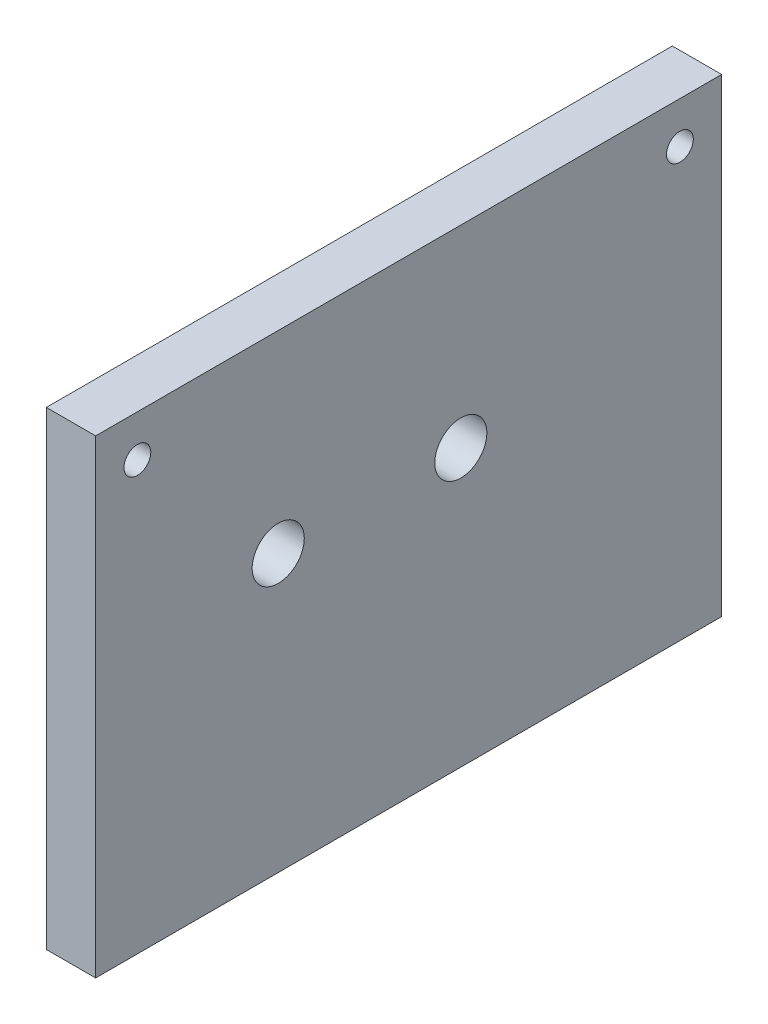
ISO-10303-21;
HEADER;
FILE_DESCRIPTION(('STEP AP214'),'2;1');
FILE_NAME('part.step','',(''),(''),'','','');
FILE_SCHEMA(('AUTOMOTIVE_DESIGN { 1 0 10303 214 1 1 1 1 }'));
ENDSEC;
DATA;
#1=APPLICATION_CONTEXT('core data for automotive mechanical design processes');
#2=APPLICATION_PROTOCOL_DEFINITION('international standard','automotive_design',2000,#1);
#3=PRODUCT_CONTEXT('',#1,'mechanical');
#4=PRODUCT('Part','Part','',(#3));
#5=PRODUCT_RELATED_PRODUCT_CATEGORY('part','',(#4));
#6=PRODUCT_DEFINITION_FORMATION('','',#4);
#7=PRODUCT_DEFINITION_CONTEXT('part definition',#1,'design');
#8=PRODUCT_DEFINITION('design','',#6,#7);
#9=PRODUCT_DEFINITION_SHAPE('','',#8);
#10=(LENGTH_UNIT() NAMED_UNIT(*) SI_UNIT(.MILLI.,.METRE.));
#11=(NAMED_UNIT(*) PLANE_ANGLE_UNIT() SI_UNIT($,.RADIAN.));
#12=(NAMED_UNIT(*) SI_UNIT($,.STERADIAN.) SOLID_ANGLE_UNIT());
#13=UNCERTAINTY_MEASURE_WITH_UNIT(LENGTH_MEASURE(1.E-05),#10,'distance_accuracy_value','');
#14=(GEOMETRIC_REPRESENTATION_CONTEXT(3) GLOBAL_UNCERTAINTY_ASSIGNED_CONTEXT((#13)) GLOBAL_UNIT_ASSIGNED_CONTEXT((#10,
#11,#12)) REPRESENTATION_CONTEXT('',''));
#15=CARTESIAN_POINT('',(0.,0.,0.));
#16=DIRECTION('',(0.,0.,1.));
#17=DIRECTION('',(1.,0.,0.));
#18=AXIS2_PLACEMENT_3D('',#15,#16,#17);
#19=CARTESIAN_POINT('',(12.,0.,0.));
#20=DIRECTION('',(1.,0.,0.));
#21=DIRECTION('',(0.,0.,-1.));
#22=AXIS2_PLACEMENT_3D('',#19,#20,#21);
#23=PLANE('',#22);
#24=CARTESIAN_POINT('',(12.,46.99,-66.04));
#25=DIRECTION('',(1.,0.,0.));
#26=DIRECTION('',(0.,0.,-1.));
#27=AXIS2_PLACEMENT_3D('',#24,#25,#26);
#28=CIRCLE('',#27,3.2639);
#29=CARTESIAN_POINT('',(12.,46.99,-69.3039));
#30=VERTEX_POINT('',#29);
#31=EDGE_CURVE('E247',#30,#30,#28,.T.);
#32=ORIENTED_EDGE('',*,*,#31,.F.);
#33=EDGE_LOOP('',(#32));
#34=FACE_BOUND('',#33,.T.);
#35=CARTESIAN_POINT('',(12.,46.99,66.04));
#36=DIRECTION('',(1.,0.,0.));
#37=DIRECTION('',(0.,0.,-1.));
#38=AXIS2_PLACEMENT_3D('',#35,#36,#37);
#39=CIRCLE('',#38,3.2639);
#40=CARTESIAN_POINT('',(12.,46.99,62.7761));
#41=VERTEX_POINT('',#40);
#42=EDGE_CURVE('E122',#41,#41,#39,.T.);
#43=ORIENTED_EDGE('',*,*,#42,.F.);
#44=EDGE_LOOP('',(#43));
#45=FACE_BOUND('',#44,.T.);
#46=CARTESIAN_POINT('',(12.,10.16,31.75));
#47=DIRECTION('',(1.,0.,0.));
#48=DIRECTION('',(0.,0.,-1.));
#49=AXIS2_PLACEMENT_3D('',#46,#47,#48);
#50=CIRCLE('',#49,6.34365);
#51=CARTESIAN_POINT('',(12.,10.16,25.40635));
#52=VERTEX_POINT('',#51);
#53=EDGE_CURVE('E146',#52,#52,#50,.T.);
#54=ORIENTED_EDGE('',*,*,#53,.F.);
#55=EDGE_LOOP('',(#54));
#56=FACE_BOUND('',#55,.T.);
#57=DIRECTION('',(0.,1.,0.));
#58=VECTOR('',#57,1.);
#59=CARTESIAN_POINT('',(12.,57.15,-76.2));
#60=LINE('',#59,#58);
#61=CARTESIAN_POINT('',(12.,-57.15,-76.2));
#62=VERTEX_POINT('',#61);
#63=CARTESIAN_POINT('',(12.,57.15,-76.2));
#64=VERTEX_POINT('',#63);
#65=EDGE_CURVE('E154',#62,#64,#60,.T.);
#66=ORIENTED_EDGE('',*,*,#65,.T.);
#67=DIRECTION('',(0.,0.,1.));
#68=VECTOR('',#67,1.);
#69=CARTESIAN_POINT('',(12.,57.15,76.2));
#70=LINE('',#69,#68);
#71=CARTESIAN_POINT('',(12.,57.15,76.2));
#72=VERTEX_POINT('',#71);
#73=EDGE_CURVE('E92',#64,#72,#70,.T.);
#74=ORIENTED_EDGE('',*,*,#73,.T.);
#75=DIRECTION('',(0.,-1.,0.));
#76=VECTOR('',#75,1.);
#77=CARTESIAN_POINT('',(12.,57.15,76.2));
#78=LINE('',#77,#76);
#79=CARTESIAN_POINT('',(12.,-57.15,76.2));
#80=VERTEX_POINT('',#79);
#81=EDGE_CURVE('E159',#72,#80,#78,.T.);
#82=ORIENTED_EDGE('',*,*,#81,.T.);
#83=DIRECTION('',(0.,0.,-1.));
#84=VECTOR('',#83,1.);
#85=CARTESIAN_POINT('',(12.,-57.15,76.2));
#86=LINE('',#85,#84);
#87=EDGE_CURVE('E61',#80,#62,#86,.T.);
#88=ORIENTED_EDGE('',*,*,#87,.T.);
#89=EDGE_LOOP('',(#66,#74,#82,#88));
#90=FACE_BOUND('',#89,.T.);
#91=CARTESIAN_POINT('',(12.,10.16,-12.7));
#92=DIRECTION('',(1.,0.,0.));
#93=DIRECTION('',(0.,0.,-1.));
#94=AXIS2_PLACEMENT_3D('',#91,#92,#93);
#95=CIRCLE('',#94,6.34365);
#96=CARTESIAN_POINT('',(12.,10.16,-19.04365));
#97=VERTEX_POINT('',#96);
#98=EDGE_CURVE('E138',#97,#97,#95,.T.);
#99=ORIENTED_EDGE('',*,*,#98,.F.);
#100=EDGE_LOOP('',(#99));
#101=FACE_BOUND('',#100,.T.);
#102=ADVANCED_FACE('F43',(#34,#45,#56,#90,#101),#23,.T.);
#103=CARTESIAN_POINT('',(0.,0.,0.));
#104=DIRECTION('',(1.,0.,0.));
#105=DIRECTION('',(0.,0.,-1.));
#106=AXIS2_PLACEMENT_3D('',#103,#104,#105);
#107=PLANE('',#106);
#108=CARTESIAN_POINT('',(0.,46.99,-66.04));
#109=DIRECTION('',(-1.,0.,0.));
#110=DIRECTION('',(0.,0.,1.));
#111=AXIS2_PLACEMENT_3D('',#108,#109,#110);
#112=CIRCLE('',#111,3.2639);
#113=CARTESIAN_POINT('',(0.,46.99,-62.7761));
#114=VERTEX_POINT('',#113);
#115=EDGE_CURVE('E250',#114,#114,#112,.T.);
#116=ORIENTED_EDGE('',*,*,#115,.F.);
#117=EDGE_LOOP('',(#116));
#118=FACE_BOUND('',#117,.T.);
#119=CARTESIAN_POINT('',(0.,46.99,66.04));
#120=DIRECTION('',(-1.,0.,0.));
#121=DIRECTION('',(0.,0.,1.));
#122=AXIS2_PLACEMENT_3D('',#119,#120,#121);
#123=CIRCLE('',#122,3.2639);
#124=CARTESIAN_POINT('',(0.,46.99,69.3039));
#125=VERTEX_POINT('',#124);
#126=EDGE_CURVE('E254',#125,#125,#123,.T.);
#127=ORIENTED_EDGE('',*,*,#126,.F.);
#128=EDGE_LOOP('',(#127));
#129=FACE_BOUND('',#128,.T.);
#130=DIRECTION('',(0.,1.,0.));
#131=VECTOR('',#130,1.);
#132=CARTESIAN_POINT('',(0.,57.15,-76.2));
#133=LINE('',#132,#131);
#134=CARTESIAN_POINT('',(0.,-57.15,-76.2));
#135=VERTEX_POINT('',#134);
#136=CARTESIAN_POINT('',(0.,57.15,-76.2));
#137=VERTEX_POINT('',#136);
#138=EDGE_CURVE('E150',#135,#137,#133,.T.);
#139=ORIENTED_EDGE('',*,*,#138,.F.);
#140=DIRECTION('',(0.,0.,-1.));
#141=VECTOR('',#140,1.);
#142=CARTESIAN_POINT('',(0.,-57.15,76.2));
#143=LINE('',#142,#141);
#144=CARTESIAN_POINT('',(0.,-57.15,76.2));
#145=VERTEX_POINT('',#144);
#146=EDGE_CURVE('E85',#145,#135,#143,.T.);
#147=ORIENTED_EDGE('',*,*,#146,.F.);
#148=DIRECTION('',(0.,-1.,0.));
#149=VECTOR('',#148,1.);
#150=CARTESIAN_POINT('',(0.,57.15,76.2));
#151=LINE('',#150,#149);
#152=CARTESIAN_POINT('',(0.,57.15,76.2));
#153=VERTEX_POINT('',#152);
#154=EDGE_CURVE('E79',#153,#145,#151,.T.);
#155=ORIENTED_EDGE('',*,*,#154,.F.);
#156=DIRECTION('',(0.,0.,1.));
#157=VECTOR('',#156,1.);
#158=CARTESIAN_POINT('',(0.,57.15,76.2));
#159=LINE('',#158,#157);
#160=EDGE_CURVE('E168',#137,#153,#159,.T.);
#161=ORIENTED_EDGE('',*,*,#160,.F.);
#162=EDGE_LOOP('',(#139,#147,#155,#161));
#163=FACE_BOUND('',#162,.T.);
#164=CARTESIAN_POINT('',(0.,10.16,31.75));
#165=DIRECTION('',(1.,0.,0.));
#166=DIRECTION('',(0.,0.,-1.));
#167=AXIS2_PLACEMENT_3D('',#164,#165,#166);
#168=CIRCLE('',#167,6.34365);
#169=CARTESIAN_POINT('',(0.,10.16,25.40635));
#170=VERTEX_POINT('',#169);
#171=EDGE_CURVE('E142',#170,#170,#168,.T.);
#172=ORIENTED_EDGE('',*,*,#171,.T.);
#173=EDGE_LOOP('',(#172));
#174=FACE_BOUND('',#173,.T.);
#175=CARTESIAN_POINT('',(0.,10.16,-12.7));
#176=DIRECTION('',(1.,0.,0.));
#177=DIRECTION('',(0.,0.,-1.));
#178=AXIS2_PLACEMENT_3D('',#175,#176,#177);
#179=CIRCLE('',#178,6.34365);
#180=CARTESIAN_POINT('',(0.,10.16,-19.04365));
#181=VERTEX_POINT('',#180);
#182=EDGE_CURVE('E137',#181,#181,#179,.T.);
#183=ORIENTED_EDGE('',*,*,#182,.T.);
#184=EDGE_LOOP('',(#183));
#185=FACE_BOUND('',#184,.T.);
#186=ADVANCED_FACE('F184',(#118,#129,#163,#174,#185),#107,.F.);
#187=CARTESIAN_POINT('',(12.,57.15,-76.2));
#188=DIRECTION('',(0.,0.,1.));
#189=DIRECTION('',(0.,-1.,0.));
#190=AXIS2_PLACEMENT_3D('',#187,#188,#189);
#191=PLANE('',#190);
#192=ORIENTED_EDGE('',*,*,#138,.T.);
#193=DIRECTION('',(-1.,0.,0.));
#194=VECTOR('',#193,1.);
#195=CARTESIAN_POINT('',(12.,57.15,-76.2));
#196=LINE('',#195,#194);
#197=EDGE_CURVE('E11',#64,#137,#196,.T.);
#198=ORIENTED_EDGE('',*,*,#197,.F.);
#199=ORIENTED_EDGE('',*,*,#65,.F.);
#200=DIRECTION('',(-1.,0.,0.));
#201=VECTOR('',#200,1.);
#202=CARTESIAN_POINT('',(12.,-57.15,-76.2));
#203=LINE('',#202,#201);
#204=EDGE_CURVE('E164',#62,#135,#203,.T.);
#205=ORIENTED_EDGE('',*,*,#204,.T.);
#206=EDGE_LOOP('',(#192,#198,#199,#205));
#207=FACE_BOUND('',#206,.T.);
#208=ADVANCED_FACE('F45',(#207),#191,.F.);
#209=CARTESIAN_POINT('',(12.,57.15,76.2));
#210=DIRECTION('',(0.,-1.,0.));
#211=DIRECTION('',(0.,0.,-1.));
#212=AXIS2_PLACEMENT_3D('',#209,#210,#211);
#213=PLANE('',#212);
#214=ORIENTED_EDGE('',*,*,#160,.T.);
#215=DIRECTION('',(-1.,0.,0.));
#216=VECTOR('',#215,1.);
#217=CARTESIAN_POINT('',(12.,57.15,76.2));
#218=LINE('',#217,#216);
#219=EDGE_CURVE('E53',#72,#153,#218,.T.);
#220=ORIENTED_EDGE('',*,*,#219,.F.);
#221=ORIENTED_EDGE('',*,*,#73,.F.);
#222=ORIENTED_EDGE('',*,*,#197,.T.);
#223=EDGE_LOOP('',(#214,#220,#221,#222));
#224=FACE_BOUND('',#223,.T.);
#225=ADVANCED_FACE('F201',(#224),#213,.F.);
#226=CARTESIAN_POINT('',(12.,57.15,76.2));
#227=DIRECTION('',(0.,0.,-1.));
#228=DIRECTION('',(0.,1.,0.));
#229=AXIS2_PLACEMENT_3D('',#226,#227,#228);
#230=PLANE('',#229);
#231=ORIENTED_EDGE('',*,*,#154,.T.);
#232=DIRECTION('',(-1.,0.,0.));
#233=VECTOR('',#232,1.);
#234=CARTESIAN_POINT('',(12.,-57.15,76.2));
#235=LINE('',#234,#233);
#236=EDGE_CURVE('E177',#80,#145,#235,.T.);
#237=ORIENTED_EDGE('',*,*,#236,.F.);
#238=ORIENTED_EDGE('',*,*,#81,.F.);
#239=ORIENTED_EDGE('',*,*,#219,.T.);
#240=EDGE_LOOP('',(#231,#237,#238,#239));
#241=FACE_BOUND('',#240,.T.);
#242=ADVANCED_FACE('F181',(#241),#230,.F.);
#243=CARTESIAN_POINT('',(12.,-57.15,76.2));
#244=DIRECTION('',(0.,1.,0.));
#245=DIRECTION('',(0.,0.,1.));
#246=AXIS2_PLACEMENT_3D('',#243,#244,#245);
#247=PLANE('',#246);
#248=CARTESIAN_POINT('',(6.,-57.15,66.675));
#249=DIRECTION('',(0.,-1.,0.));
#250=DIRECTION('',(0.,0.,-1.));
#251=AXIS2_PLACEMENT_3D('',#248,#249,#250);
#252=CIRCLE('',#251,2.01929999999999);
#253=CARTESIAN_POINT('',(6.,-57.15,64.6557));
#254=VERTEX_POINT('',#253);
#255=EDGE_CURVE('E114',#254,#254,#252,.T.);
#256=ORIENTED_EDGE('',*,*,#255,.F.);
#257=EDGE_LOOP('',(#256));
#258=FACE_BOUND('',#257,.T.);
#259=CARTESIAN_POINT('',(6.,-57.15,0.));
#260=DIRECTION('',(0.,-1.,0.));
#261=DIRECTION('',(0.,0.,-1.));
#262=AXIS2_PLACEMENT_3D('',#259,#260,#261);
#263=CIRCLE('',#262,2.01929999999999);
#264=CARTESIAN_POINT('',(6.,-57.15,-2.01929999999999));
#265=VERTEX_POINT('',#264);
#266=EDGE_CURVE('E113',#265,#265,#263,.T.);
#267=ORIENTED_EDGE('',*,*,#266,.F.);
#268=EDGE_LOOP('',(#267));
#269=FACE_BOUND('',#268,.T.);
#270=CARTESIAN_POINT('',(6.,-57.15,-66.675));
#271=DIRECTION('',(0.,-1.,0.));
#272=DIRECTION('',(0.,0.,-1.));
#273=AXIS2_PLACEMENT_3D('',#270,#271,#272);
#274=CIRCLE('',#273,2.01929999999999);
#275=CARTESIAN_POINT('',(6.,-57.15,-68.6943));
#276=VERTEX_POINT('',#275);
#277=EDGE_CURVE('E129',#276,#276,#274,.T.);
#278=ORIENTED_EDGE('',*,*,#277,.F.);
#279=EDGE_LOOP('',(#278));
#280=FACE_BOUND('',#279,.T.);
#281=ORIENTED_EDGE('',*,*,#146,.T.);
#282=ORIENTED_EDGE('',*,*,#204,.F.);
#283=ORIENTED_EDGE('',*,*,#87,.F.);
#284=ORIENTED_EDGE('',*,*,#236,.T.);
#285=EDGE_LOOP('',(#281,#282,#283,#284));
#286=FACE_BOUND('',#285,.T.);
#287=ADVANCED_FACE('F189',(#258,#269,#280,#286),#247,.F.);
#288=CARTESIAN_POINT('',(12.,10.16,31.75));
#289=DIRECTION('',(-1.,0.,0.));
#290=DIRECTION('',(0.,0.,1.));
#291=AXIS2_PLACEMENT_3D('',#288,#289,#290);
#292=CYLINDRICAL_SURFACE('',#291,6.34365);
#293=ORIENTED_EDGE('',*,*,#53,.T.);
#294=EDGE_LOOP('',(#293));
#295=FACE_BOUND('',#294,.T.);
#296=ORIENTED_EDGE('',*,*,#171,.F.);
#297=EDGE_LOOP('',(#296));
#298=FACE_BOUND('',#297,.T.);
#299=ADVANCED_FACE('F191',(#295,#298),#292,.F.);
#300=CARTESIAN_POINT('',(12.,10.16,-12.7));
#301=DIRECTION('',(-1.,0.,0.));
#302=DIRECTION('',(0.,0.,1.));
#303=AXIS2_PLACEMENT_3D('',#300,#301,#302);
#304=CYLINDRICAL_SURFACE('',#303,6.34365);
#305=ORIENTED_EDGE('',*,*,#98,.T.);
#306=EDGE_LOOP('',(#305));
#307=FACE_BOUND('',#306,.T.);
#308=ORIENTED_EDGE('',*,*,#182,.F.);
#309=EDGE_LOOP('',(#308));
#310=FACE_BOUND('',#309,.T.);
#311=ADVANCED_FACE('F198',(#307,#310),#304,.F.);
#312=CARTESIAN_POINT('',(6.,-44.45,-66.675));
#313=DIRECTION('',(0.,-1.,0.));
#314=DIRECTION('',(0.,0.,-1.));
#315=AXIS2_PLACEMENT_3D('',#312,#313,#314);
#316=CONICAL_SURFACE('',#315,2.0193,1.02974425867665);
#317=CARTESIAN_POINT('',(6.,-43.2366821519976,-66.675));
#318=VERTEX_POINT('',#317);
#319=VERTEX_LOOP('',#318);
#320=FACE_BOUND('',#319,.T.);
#321=CARTESIAN_POINT('',(6.,-44.45,-66.675));
#322=DIRECTION('',(0.,-1.,0.));
#323=DIRECTION('',(0.,0.,-1.));
#324=AXIS2_PLACEMENT_3D('',#321,#322,#323);
#325=CIRCLE('',#324,2.0193);
#326=CARTESIAN_POINT('',(6.,-44.45,-68.6943));
#327=VERTEX_POINT('',#326);
#328=EDGE_CURVE('E133',#327,#327,#325,.T.);
#329=ORIENTED_EDGE('',*,*,#328,.T.);
#330=EDGE_LOOP('',(#329));
#331=FACE_BOUND('',#330,.T.);
#332=ADVANCED_FACE('F218',(#320,#331),#316,.F.);
#333=CARTESIAN_POINT('',(6.,-57.15,-66.675));
#334=DIRECTION('',(0.,-1.,0.));
#335=DIRECTION('',(0.,0.,-1.));
#336=AXIS2_PLACEMENT_3D('',#333,#334,#335);
#337=CYLINDRICAL_SURFACE('',#336,2.01929999999999);
#338=ORIENTED_EDGE('',*,*,#328,.F.);
#339=EDGE_LOOP('',(#338));
#340=FACE_BOUND('',#339,.T.);
#341=ORIENTED_EDGE('',*,*,#277,.T.);
#342=EDGE_LOOP('',(#341));
#343=FACE_BOUND('',#342,.T.);
#344=ADVANCED_FACE('F222',(#340,#343),#337,.F.);
#345=CARTESIAN_POINT('',(6.,-44.45,0.));
#346=DIRECTION('',(0.,-1.,0.));
#347=DIRECTION('',(0.,0.,-1.));
#348=AXIS2_PLACEMENT_3D('',#345,#346,#347);
#349=CONICAL_SURFACE('',#348,2.0193,1.02974425867665);
#350=CARTESIAN_POINT('',(5.99999999999999,-43.2366821519976,0.));
#351=VERTEX_POINT('',#350);
#352=VERTEX_LOOP('',#351);
#353=FACE_BOUND('',#352,.T.);
#354=CARTESIAN_POINT('',(6.,-44.45,0.));
#355=DIRECTION('',(0.,-1.,0.));
#356=DIRECTION('',(0.,0.,-1.));
#357=AXIS2_PLACEMENT_3D('',#354,#355,#356);
#358=CIRCLE('',#357,2.0193);
#359=CARTESIAN_POINT('',(6.,-44.45,-2.0193));
#360=VERTEX_POINT('',#359);
#361=EDGE_CURVE('E119',#360,#360,#358,.T.);
#362=ORIENTED_EDGE('',*,*,#361,.T.);
#363=EDGE_LOOP('',(#362));
#364=FACE_BOUND('',#363,.T.);
#365=ADVANCED_FACE('F226',(#353,#364),#349,.F.);
#366=CARTESIAN_POINT('',(6.,-57.15,0.));
#367=DIRECTION('',(0.,-1.,0.));
#368=DIRECTION('',(0.,0.,-1.));
#369=AXIS2_PLACEMENT_3D('',#366,#367,#368);
#370=CYLINDRICAL_SURFACE('',#369,2.01929999999999);
#371=ORIENTED_EDGE('',*,*,#361,.F.);
#372=EDGE_LOOP('',(#371));
#373=FACE_BOUND('',#372,.T.);
#374=ORIENTED_EDGE('',*,*,#266,.T.);
#375=EDGE_LOOP('',(#374));
#376=FACE_BOUND('',#375,.T.);
#377=ADVANCED_FACE('F106',(#373,#376),#370,.F.);
#378=CARTESIAN_POINT('',(6.,-44.45,66.675));
#379=DIRECTION('',(0.,-1.,0.));
#380=DIRECTION('',(0.,0.,-1.));
#381=AXIS2_PLACEMENT_3D('',#378,#379,#380);
#382=CONICAL_SURFACE('',#381,2.0193,1.02974425867665);
#383=CARTESIAN_POINT('',(5.99999999999999,-43.2366821519976,66.675));
#384=VERTEX_POINT('',#383);
#385=VERTEX_LOOP('',#384);
#386=FACE_BOUND('',#385,.T.);
#387=CARTESIAN_POINT('',(6.,-44.45,66.675));
#388=DIRECTION('',(0.,-1.,0.));
#389=DIRECTION('',(0.,0.,-1.));
#390=AXIS2_PLACEMENT_3D('',#387,#388,#389);
#391=CIRCLE('',#390,2.0193);
#392=CARTESIAN_POINT('',(6.,-44.45,64.6557));
#393=VERTEX_POINT('',#392);
#394=EDGE_CURVE('E110',#393,#393,#391,.T.);
#395=ORIENTED_EDGE('',*,*,#394,.T.);
#396=EDGE_LOOP('',(#395));
#397=FACE_BOUND('',#396,.T.);
#398=ADVANCED_FACE('F102',(#386,#397),#382,.F.);
#399=CARTESIAN_POINT('',(6.,-57.15,66.675));
#400=DIRECTION('',(0.,-1.,0.));
#401=DIRECTION('',(0.,0.,-1.));
#402=AXIS2_PLACEMENT_3D('',#399,#400,#401);
#403=CYLINDRICAL_SURFACE('',#402,2.01929999999999);
#404=ORIENTED_EDGE('',*,*,#394,.F.);
#405=EDGE_LOOP('',(#404));
#406=FACE_BOUND('',#405,.T.);
#407=ORIENTED_EDGE('',*,*,#255,.T.);
#408=EDGE_LOOP('',(#407));
#409=FACE_BOUND('',#408,.T.);
#410=ADVANCED_FACE('F105',(#406,#409),#403,.F.);
#411=CARTESIAN_POINT('',(0.,46.99,66.04));
#412=DIRECTION('',(-1.,0.,0.));
#413=DIRECTION('',(0.,0.,1.));
#414=AXIS2_PLACEMENT_3D('',#411,#412,#413);
#415=CYLINDRICAL_SURFACE('',#414,3.2639);
#416=ORIENTED_EDGE('',*,*,#42,.T.);
#417=EDGE_LOOP('',(#416));
#418=FACE_BOUND('',#417,.T.);
#419=ORIENTED_EDGE('',*,*,#126,.T.);
#420=EDGE_LOOP('',(#419));
#421=FACE_BOUND('',#420,.T.);
#422=ADVANCED_FACE('F236',(#418,#421),#415,.F.);
#423=CARTESIAN_POINT('',(0.,46.99,-66.04));
#424=DIRECTION('',(-1.,0.,0.));
#425=DIRECTION('',(0.,0.,1.));
#426=AXIS2_PLACEMENT_3D('',#423,#424,#425);
#427=CYLINDRICAL_SURFACE('',#426,3.2639);
#428=ORIENTED_EDGE('',*,*,#31,.T.);
#429=EDGE_LOOP('',(#428));
#430=FACE_BOUND('',#429,.T.);
#431=ORIENTED_EDGE('',*,*,#115,.T.);
#432=EDGE_LOOP('',(#431));
#433=FACE_BOUND('',#432,.T.);
#434=ADVANCED_FACE('F239',(#430,#433),#427,.F.);
#435=CLOSED_SHELL('',(#102,#186,#208,#225,#242,#287,#299,#311,#332,#344,#365,#377,#398,#410,
#422,#434));
#436=MANIFOLD_SOLID_BREP('B2',#435);
#437=ADVANCED_BREP_SHAPE_REPRESENTATION('',(#18,#436),#14);
#438=SHAPE_DEFINITION_REPRESENTATION(#9,#437);
ENDSEC;
END-ISO-10303-21;
